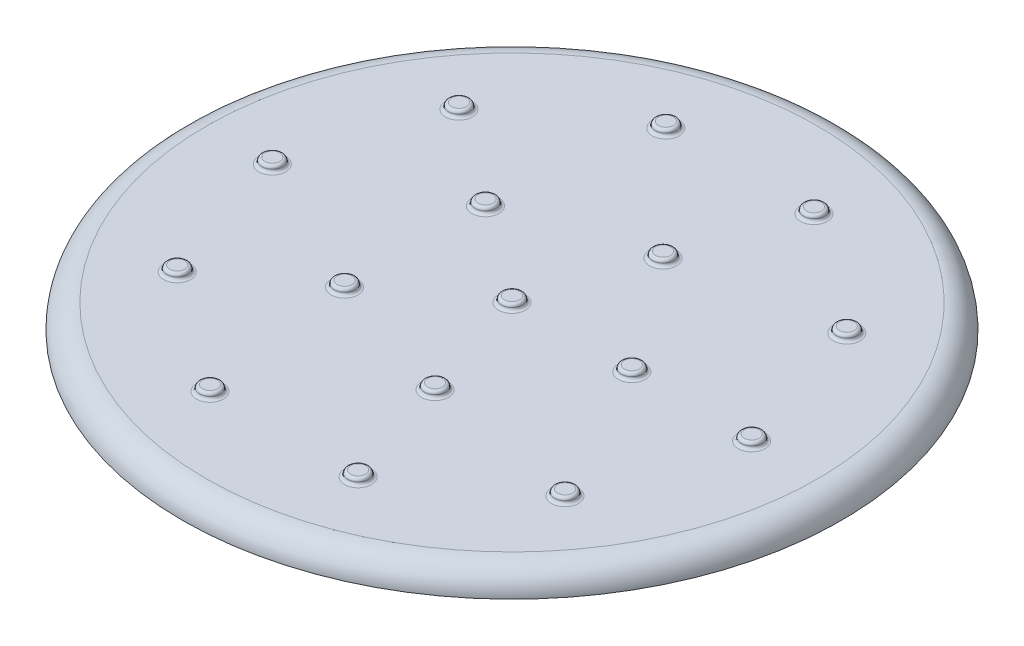
ISO-10303-21;
HEADER;
FILE_DESCRIPTION(('STEP AP214'),'2;1');
FILE_NAME('part.step','',(''),(''),'','','');
FILE_SCHEMA(('AUTOMOTIVE_DESIGN { 1 0 10303 214 1 1 1 1 }'));
ENDSEC;
DATA;
#1=APPLICATION_CONTEXT('core data for automotive mechanical design processes');
#2=APPLICATION_PROTOCOL_DEFINITION('international standard','automotive_design',2000,#1);
#3=PRODUCT_CONTEXT('',#1,'mechanical');
#4=PRODUCT('Part','Part','',(#3));
#5=PRODUCT_RELATED_PRODUCT_CATEGORY('part','',(#4));
#6=PRODUCT_DEFINITION_FORMATION('','',#4);
#7=PRODUCT_DEFINITION_CONTEXT('part definition',#1,'design');
#8=PRODUCT_DEFINITION('design','',#6,#7);
#9=PRODUCT_DEFINITION_SHAPE('','',#8);
#10=(LENGTH_UNIT() NAMED_UNIT(*) SI_UNIT(.MILLI.,.METRE.));
#11=(NAMED_UNIT(*) PLANE_ANGLE_UNIT() SI_UNIT($,.RADIAN.));
#12=(NAMED_UNIT(*) SI_UNIT($,.STERADIAN.) SOLID_ANGLE_UNIT());
#13=UNCERTAINTY_MEASURE_WITH_UNIT(LENGTH_MEASURE(1.E-05),#10,'distance_accuracy_value','');
#14=(GEOMETRIC_REPRESENTATION_CONTEXT(3) GLOBAL_UNCERTAINTY_ASSIGNED_CONTEXT((#13)) GLOBAL_UNIT_ASSIGNED_CONTEXT((#10,
#11,#12)) REPRESENTATION_CONTEXT('',''));
#15=CARTESIAN_POINT('',(0.,0.,0.));
#16=DIRECTION('',(0.,0.,1.));
#17=DIRECTION('',(1.,0.,0.));
#18=AXIS2_PLACEMENT_3D('',#15,#16,#17);
#19=CARTESIAN_POINT('',(0.,4.,0.));
#20=DIRECTION('',(0.,1.,0.));
#21=DIRECTION('',(0.,0.,1.));
#22=AXIS2_PLACEMENT_3D('',#19,#20,#21);
#23=PLANE('',#22);
#24=CARTESIAN_POINT('',(0.,4.,0.));
#25=DIRECTION('',(0.,1.,0.));
#26=DIRECTION('',(0.,0.,1.));
#27=AXIS2_PLACEMENT_3D('',#24,#25,#26);
#28=CIRCLE('',#27,2.25);
#29=CARTESIAN_POINT('',(0.,4.,2.25));
#30=VERTEX_POINT('',#29);
#31=EDGE_CURVE('E321',#30,#30,#28,.F.);
#32=ORIENTED_EDGE('',*,*,#31,.T.);
#33=EDGE_LOOP('',(#32));
#34=FACE_BOUND('',#33,.T.);
#35=CARTESIAN_POINT('',(20.,4.,0.));
#36=DIRECTION('',(0.,1.,0.));
#37=DIRECTION('',(0.,0.,1.));
#38=AXIS2_PLACEMENT_3D('',#35,#36,#37);
#39=CIRCLE('',#38,2.25);
#40=CARTESIAN_POINT('',(20.,4.,2.25));
#41=VERTEX_POINT('',#40);
#42=EDGE_CURVE('E399',#41,#41,#39,.F.);
#43=ORIENTED_EDGE('',*,*,#42,.T.);
#44=EDGE_LOOP('',(#43));
#45=FACE_BOUND('',#44,.T.);
#46=CARTESIAN_POINT('',(40.,4.,0.));
#47=DIRECTION('',(0.,1.,0.));
#48=DIRECTION('',(0.,0.,1.));
#49=AXIS2_PLACEMENT_3D('',#46,#47,#48);
#50=CIRCLE('',#49,2.25);
#51=CARTESIAN_POINT('',(40.,4.,2.25));
#52=VERTEX_POINT('',#51);
#53=EDGE_CURVE('E402',#52,#52,#50,.F.);
#54=ORIENTED_EDGE('',*,*,#53,.T.);
#55=EDGE_LOOP('',(#54));
#56=FACE_BOUND('',#55,.T.);
#57=CARTESIAN_POINT('',(6.1803398874989,4.,19.0211303259031));
#58=DIRECTION('',(0.,1.,0.));
#59=DIRECTION('',(0.,0.,1.));
#60=AXIS2_PLACEMENT_3D('',#57,#58,#59);
#61=CIRCLE('',#60,2.25);
#62=CARTESIAN_POINT('',(6.1803398874989,4.,21.2711303259031));
#63=VERTEX_POINT('',#62);
#64=EDGE_CURVE('E405',#63,#63,#61,.F.);
#65=ORIENTED_EDGE('',*,*,#64,.T.);
#66=EDGE_LOOP('',(#65));
#67=FACE_BOUND('',#66,.T.);
#68=CARTESIAN_POINT('',(-16.180339887499,4.,11.7557050458494));
#69=DIRECTION('',(0.,1.,0.));
#70=DIRECTION('',(0.,0.,1.));
#71=AXIS2_PLACEMENT_3D('',#68,#69,#70);
#72=CIRCLE('',#71,2.25);
#73=CARTESIAN_POINT('',(-16.180339887499,4.,14.0057050458494));
#74=VERTEX_POINT('',#73);
#75=EDGE_CURVE('E408',#74,#74,#72,.F.);
#76=ORIENTED_EDGE('',*,*,#75,.T.);
#77=EDGE_LOOP('',(#76));
#78=FACE_BOUND('',#77,.T.);
#79=CARTESIAN_POINT('',(-16.1803398874988,4.,-11.7557050458496));
#80=DIRECTION('',(0.,1.,0.));
#81=DIRECTION('',(0.,0.,1.));
#82=AXIS2_PLACEMENT_3D('',#79,#80,#81);
#83=CIRCLE('',#82,2.25);
#84=CARTESIAN_POINT('',(-16.1803398874988,4.,-9.5057050458496));
#85=VERTEX_POINT('',#84);
#86=EDGE_CURVE('E411',#85,#85,#83,.F.);
#87=ORIENTED_EDGE('',*,*,#86,.T.);
#88=EDGE_LOOP('',(#87));
#89=FACE_BOUND('',#88,.T.);
#90=CARTESIAN_POINT('',(6.18033988749916,4.,-19.021130325903));
#91=DIRECTION('',(0.,1.,0.));
#92=DIRECTION('',(0.,0.,1.));
#93=AXIS2_PLACEMENT_3D('',#90,#91,#92);
#94=CIRCLE('',#93,2.25);
#95=CARTESIAN_POINT('',(6.18033988749916,4.,-16.771130325903));
#96=VERTEX_POINT('',#95);
#97=EDGE_CURVE('E414',#96,#96,#94,.F.);
#98=ORIENTED_EDGE('',*,*,#97,.T.);
#99=EDGE_LOOP('',(#98));
#100=FACE_BOUND('',#99,.T.);
#101=CARTESIAN_POINT('',(32.3606797749979,4.,23.511410091699));
#102=DIRECTION('',(0.,1.,0.));
#103=DIRECTION('',(0.,0.,1.));
#104=AXIS2_PLACEMENT_3D('',#101,#102,#103);
#105=CIRCLE('',#104,2.25);
#106=CARTESIAN_POINT('',(32.3606797749979,4.,25.761410091699));
#107=VERTEX_POINT('',#106);
#108=EDGE_CURVE('E417',#107,#107,#105,.F.);
#109=ORIENTED_EDGE('',*,*,#108,.T.);
#110=EDGE_LOOP('',(#109));
#111=FACE_BOUND('',#110,.T.);
#112=CARTESIAN_POINT('',(12.3606797749978,4.,38.0422606518062));
#113=DIRECTION('',(0.,1.,0.));
#114=DIRECTION('',(0.,0.,1.));
#115=AXIS2_PLACEMENT_3D('',#112,#113,#114);
#116=CIRCLE('',#115,2.25);
#117=CARTESIAN_POINT('',(12.3606797749978,4.,40.2922606518062));
#118=VERTEX_POINT('',#117);
#119=EDGE_CURVE('E420',#118,#118,#116,.F.);
#120=ORIENTED_EDGE('',*,*,#119,.T.);
#121=EDGE_LOOP('',(#120));
#122=FACE_BOUND('',#121,.T.);
#123=CARTESIAN_POINT('',(-12.3606797749981,4.,38.0422606518061));
#124=DIRECTION('',(0.,1.,0.));
#125=DIRECTION('',(0.,0.,1.));
#126=AXIS2_PLACEMENT_3D('',#123,#124,#125);
#127=CIRCLE('',#126,2.25);
#128=CARTESIAN_POINT('',(-12.3606797749981,4.,40.2922606518061));
#129=VERTEX_POINT('',#128);
#130=EDGE_CURVE('E423',#129,#129,#127,.F.);
#131=ORIENTED_EDGE('',*,*,#130,.T.);
#132=EDGE_LOOP('',(#131));
#133=FACE_BOUND('',#132,.T.);
#134=CARTESIAN_POINT('',(-32.360679774998,4.,23.5114100916987));
#135=DIRECTION('',(0.,1.,0.));
#136=DIRECTION('',(0.,0.,1.));
#137=AXIS2_PLACEMENT_3D('',#134,#135,#136);
#138=CIRCLE('',#137,2.25);
#139=CARTESIAN_POINT('',(-32.360679774998,4.,25.7614100916987));
#140=VERTEX_POINT('',#139);
#141=EDGE_CURVE('E426',#140,#140,#138,.F.);
#142=ORIENTED_EDGE('',*,*,#141,.T.);
#143=EDGE_LOOP('',(#142));
#144=FACE_BOUND('',#143,.T.);
#145=CARTESIAN_POINT('',(-40.,4.,-2.79318507107451E-13));
#146=DIRECTION('',(0.,1.,0.));
#147=DIRECTION('',(0.,0.,1.));
#148=AXIS2_PLACEMENT_3D('',#145,#146,#147);
#149=CIRCLE('',#148,2.25000000000001);
#150=CARTESIAN_POINT('',(-40.,4.,2.24999999999973));
#151=VERTEX_POINT('',#150);
#152=EDGE_CURVE('E429',#151,#151,#149,.F.);
#153=ORIENTED_EDGE('',*,*,#152,.T.);
#154=EDGE_LOOP('',(#153));
#155=FACE_BOUND('',#154,.T.);
#156=CARTESIAN_POINT('',(-32.3606797749977,4.,-23.5114100916992));
#157=DIRECTION('',(0.,1.,0.));
#158=DIRECTION('',(0.,0.,1.));
#159=AXIS2_PLACEMENT_3D('',#156,#157,#158);
#160=CIRCLE('',#159,2.25);
#161=CARTESIAN_POINT('',(-32.3606797749977,4.,-21.2614100916992));
#162=VERTEX_POINT('',#161);
#163=EDGE_CURVE('E432',#162,#162,#160,.F.);
#164=ORIENTED_EDGE('',*,*,#163,.T.);
#165=EDGE_LOOP('',(#164));
#166=FACE_BOUND('',#165,.T.);
#167=CARTESIAN_POINT('',(-12.3606797749975,4.,-38.0422606518063));
#168=DIRECTION('',(0.,1.,0.));
#169=DIRECTION('',(0.,0.,1.));
#170=AXIS2_PLACEMENT_3D('',#167,#168,#169);
#171=CIRCLE('',#170,2.25);
#172=CARTESIAN_POINT('',(-12.3606797749975,4.,-35.7922606518063));
#173=VERTEX_POINT('',#172);
#174=EDGE_CURVE('E435',#173,#173,#171,.F.);
#175=ORIENTED_EDGE('',*,*,#174,.T.);
#176=EDGE_LOOP('',(#175));
#177=FACE_BOUND('',#176,.T.);
#178=CARTESIAN_POINT('',(12.3606797749983,4.,-38.042260651806));
#179=DIRECTION('',(0.,1.,0.));
#180=DIRECTION('',(0.,0.,1.));
#181=AXIS2_PLACEMENT_3D('',#178,#179,#180);
#182=CIRCLE('',#181,2.25);
#183=CARTESIAN_POINT('',(12.3606797749983,4.,-35.792260651806));
#184=VERTEX_POINT('',#183);
#185=EDGE_CURVE('E438',#184,#184,#182,.F.);
#186=ORIENTED_EDGE('',*,*,#185,.T.);
#187=EDGE_LOOP('',(#186));
#188=FACE_BOUND('',#187,.T.);
#189=CARTESIAN_POINT('',(32.3606797749982,4.,-23.5114100916985));
#190=DIRECTION('',(0.,1.,0.));
#191=DIRECTION('',(0.,0.,1.));
#192=AXIS2_PLACEMENT_3D('',#189,#190,#191);
#193=CIRCLE('',#192,2.25);
#194=CARTESIAN_POINT('',(32.3606797749982,4.,-21.2614100916985));
#195=VERTEX_POINT('',#194);
#196=EDGE_CURVE('E441',#195,#195,#193,.F.);
#197=ORIENTED_EDGE('',*,*,#196,.T.);
#198=EDGE_LOOP('',(#197));
#199=FACE_BOUND('',#198,.T.);
#200=CARTESIAN_POINT('',(0.,4.,0.));
#201=DIRECTION('',(0.,1.,0.));
#202=DIRECTION('',(0.,0.,1.));
#203=AXIS2_PLACEMENT_3D('',#200,#201,#202);
#204=CIRCLE('',#203,51.);
#205=CARTESIAN_POINT('',(0.,4.,51.));
#206=VERTEX_POINT('',#205);
#207=EDGE_CURVE('E444',#206,#206,#204,.T.);
#208=ORIENTED_EDGE('',*,*,#207,.T.);
#209=EDGE_LOOP('',(#208));
#210=FACE_BOUND('',#209,.T.);
#211=ADVANCED_FACE('F31',(#34,#45,#56,#67,#78,#89,#100,#111,#122,#133,#144,#155,#166,#177,#188,
#199,#210),#23,.T.);
#212=CARTESIAN_POINT('',(0.,0.,0.));
#213=DIRECTION('',(0.,1.,0.));
#214=DIRECTION('',(0.,0.,1.));
#215=AXIS2_PLACEMENT_3D('',#212,#213,#214);
#216=PLANE('',#215);
#217=CARTESIAN_POINT('',(0.,0.,0.));
#218=DIRECTION('',(0.,1.,0.));
#219=DIRECTION('',(0.,0.,1.));
#220=AXIS2_PLACEMENT_3D('',#217,#218,#219);
#221=CIRCLE('',#220,55.);
#222=CARTESIAN_POINT('',(0.,0.,55.));
#223=VERTEX_POINT('',#222);
#224=EDGE_CURVE('E51',#223,#223,#221,.T.);
#225=ORIENTED_EDGE('',*,*,#224,.F.);
#226=EDGE_LOOP('',(#225));
#227=FACE_BOUND('',#226,.T.);
#228=ADVANCED_FACE('F111',(#227),#216,.F.);
#229=CARTESIAN_POINT('',(0.,0.,0.));
#230=DIRECTION('',(0.,1.,0.));
#231=DIRECTION('',(0.,0.,1.));
#232=AXIS2_PLACEMENT_3D('',#229,#230,#231);
#233=TOROIDAL_SURFACE('',#232,51.,4.);
#234=ORIENTED_EDGE('',*,*,#224,.T.);
#235=EDGE_LOOP('',(#234));
#236=FACE_BOUND('',#235,.T.);
#237=ORIENTED_EDGE('',*,*,#207,.F.);
#238=EDGE_LOOP('',(#237));
#239=FACE_BOUND('',#238,.T.);
#240=ADVANCED_FACE('F117',(#236,#239),#233,.T.);
#241=CARTESIAN_POINT('',(0.,5.,0.));
#242=DIRECTION('',(0.,1.,0.));
#243=DIRECTION('',(0.,0.,1.));
#244=AXIS2_PLACEMENT_3D('',#241,#242,#243);
#245=PLANE('',#244);
#246=CARTESIAN_POINT('',(0.,5.,0.));
#247=DIRECTION('',(0.,1.,0.));
#248=DIRECTION('',(0.,0.,1.));
#249=AXIS2_PLACEMENT_3D('',#246,#247,#248);
#250=CIRCLE('',#249,1.25);
#251=CARTESIAN_POINT('',(0.,5.,1.25));
#252=VERTEX_POINT('',#251);
#253=EDGE_CURVE('E315',#252,#252,#250,.T.);
#254=ORIENTED_EDGE('',*,*,#253,.T.);
#255=EDGE_LOOP('',(#254));
#256=FACE_BOUND('',#255,.T.);
#257=ADVANCED_FACE('F123',(#256),#245,.T.);
#258=CARTESIAN_POINT('',(20.,5.,0.));
#259=DIRECTION('',(0.,1.,0.));
#260=DIRECTION('',(0.,0.,1.));
#261=AXIS2_PLACEMENT_3D('',#258,#259,#260);
#262=PLANE('',#261);
#263=CARTESIAN_POINT('',(20.,5.,0.));
#264=DIRECTION('',(0.,1.,0.));
#265=DIRECTION('',(0.,0.,1.));
#266=AXIS2_PLACEMENT_3D('',#263,#264,#265);
#267=CIRCLE('',#266,1.25);
#268=CARTESIAN_POINT('',(20.,5.,1.25));
#269=VERTEX_POINT('',#268);
#270=EDGE_CURVE('E313',#269,#269,#267,.T.);
#271=ORIENTED_EDGE('',*,*,#270,.T.);
#272=EDGE_LOOP('',(#271));
#273=FACE_BOUND('',#272,.T.);
#274=ADVANCED_FACE('F303',(#273),#262,.T.);
#275=CARTESIAN_POINT('',(40.,5.,0.));
#276=DIRECTION('',(0.,1.,0.));
#277=DIRECTION('',(0.,0.,1.));
#278=AXIS2_PLACEMENT_3D('',#275,#276,#277);
#279=PLANE('',#278);
#280=CARTESIAN_POINT('',(40.,5.,0.));
#281=DIRECTION('',(0.,1.,0.));
#282=DIRECTION('',(0.,0.,1.));
#283=AXIS2_PLACEMENT_3D('',#280,#281,#282);
#284=CIRCLE('',#283,1.25);
#285=CARTESIAN_POINT('',(40.,5.,1.25));
#286=VERTEX_POINT('',#285);
#287=EDGE_CURVE('E314',#286,#286,#284,.T.);
#288=ORIENTED_EDGE('',*,*,#287,.T.);
#289=EDGE_LOOP('',(#288));
#290=FACE_BOUND('',#289,.T.);
#291=ADVANCED_FACE('F300',(#290),#279,.T.);
#292=CARTESIAN_POINT('',(6.1803398874989,5.,19.0211303259031));
#293=DIRECTION('',(0.,1.,0.));
#294=DIRECTION('',(0.,0.,1.));
#295=AXIS2_PLACEMENT_3D('',#292,#293,#294);
#296=PLANE('',#295);
#297=CARTESIAN_POINT('',(6.1803398874989,5.,19.0211303259031));
#298=DIRECTION('',(0.,1.,0.));
#299=DIRECTION('',(0.,0.,1.));
#300=AXIS2_PLACEMENT_3D('',#297,#298,#299);
#301=CIRCLE('',#300,1.25);
#302=CARTESIAN_POINT('',(6.1803398874989,5.,20.2711303259031));
#303=VERTEX_POINT('',#302);
#304=EDGE_CURVE('E318',#303,#303,#301,.T.);
#305=ORIENTED_EDGE('',*,*,#304,.T.);
#306=EDGE_LOOP('',(#305));
#307=FACE_BOUND('',#306,.T.);
#308=ADVANCED_FACE('F296',(#307),#296,.T.);
#309=CARTESIAN_POINT('',(-16.180339887499,5.,11.7557050458494));
#310=DIRECTION('',(0.,1.,0.));
#311=DIRECTION('',(0.,0.,1.));
#312=AXIS2_PLACEMENT_3D('',#309,#310,#311);
#313=PLANE('',#312);
#314=CARTESIAN_POINT('',(-16.180339887499,5.,11.7557050458494));
#315=DIRECTION('',(0.,1.,0.));
#316=DIRECTION('',(0.,0.,1.));
#317=AXIS2_PLACEMENT_3D('',#314,#315,#316);
#318=CIRCLE('',#317,1.25);
#319=CARTESIAN_POINT('',(-16.180339887499,5.,13.0057050458494));
#320=VERTEX_POINT('',#319);
#321=EDGE_CURVE('E327',#320,#320,#318,.T.);
#322=ORIENTED_EDGE('',*,*,#321,.T.);
#323=EDGE_LOOP('',(#322));
#324=FACE_BOUND('',#323,.T.);
#325=ADVANCED_FACE('F292',(#324),#313,.T.);
#326=CARTESIAN_POINT('',(-16.1803398874988,5.,-11.7557050458496));
#327=DIRECTION('',(0.,1.,0.));
#328=DIRECTION('',(0.,0.,1.));
#329=AXIS2_PLACEMENT_3D('',#326,#327,#328);
#330=PLANE('',#329);
#331=CARTESIAN_POINT('',(-16.1803398874988,5.,-11.7557050458496));
#332=DIRECTION('',(0.,1.,0.));
#333=DIRECTION('',(0.,0.,1.));
#334=AXIS2_PLACEMENT_3D('',#331,#332,#333);
#335=CIRCLE('',#334,1.25);
#336=CARTESIAN_POINT('',(-16.1803398874988,5.,-10.5057050458496));
#337=VERTEX_POINT('',#336);
#338=EDGE_CURVE('E330',#337,#337,#335,.T.);
#339=ORIENTED_EDGE('',*,*,#338,.T.);
#340=EDGE_LOOP('',(#339));
#341=FACE_BOUND('',#340,.T.);
#342=ADVANCED_FACE('F288',(#341),#330,.T.);
#343=CARTESIAN_POINT('',(6.18033988749916,5.,-19.021130325903));
#344=DIRECTION('',(0.,1.,0.));
#345=DIRECTION('',(0.,0.,1.));
#346=AXIS2_PLACEMENT_3D('',#343,#344,#345);
#347=PLANE('',#346);
#348=CARTESIAN_POINT('',(6.18033988749916,5.,-19.021130325903));
#349=DIRECTION('',(0.,1.,0.));
#350=DIRECTION('',(0.,0.,1.));
#351=AXIS2_PLACEMENT_3D('',#348,#349,#350);
#352=CIRCLE('',#351,1.25);
#353=CARTESIAN_POINT('',(6.18033988749916,5.,-17.771130325903));
#354=VERTEX_POINT('',#353);
#355=EDGE_CURVE('E333',#354,#354,#352,.T.);
#356=ORIENTED_EDGE('',*,*,#355,.T.);
#357=EDGE_LOOP('',(#356));
#358=FACE_BOUND('',#357,.T.);
#359=ADVANCED_FACE('F284',(#358),#347,.T.);
#360=CARTESIAN_POINT('',(32.3606797749979,5.,23.511410091699));
#361=DIRECTION('',(0.,1.,0.));
#362=DIRECTION('',(0.,0.,1.));
#363=AXIS2_PLACEMENT_3D('',#360,#361,#362);
#364=PLANE('',#363);
#365=CARTESIAN_POINT('',(32.3606797749979,5.,23.511410091699));
#366=DIRECTION('',(0.,1.,0.));
#367=DIRECTION('',(0.,0.,1.));
#368=AXIS2_PLACEMENT_3D('',#365,#366,#367);
#369=CIRCLE('',#368,1.25);
#370=CARTESIAN_POINT('',(32.3606797749979,5.,24.761410091699));
#371=VERTEX_POINT('',#370);
#372=EDGE_CURVE('E336',#371,#371,#369,.T.);
#373=ORIENTED_EDGE('',*,*,#372,.T.);
#374=EDGE_LOOP('',(#373));
#375=FACE_BOUND('',#374,.T.);
#376=ADVANCED_FACE('F280',(#375),#364,.T.);
#377=CARTESIAN_POINT('',(12.3606797749978,5.,38.0422606518062));
#378=DIRECTION('',(0.,1.,0.));
#379=DIRECTION('',(0.,0.,1.));
#380=AXIS2_PLACEMENT_3D('',#377,#378,#379);
#381=PLANE('',#380);
#382=CARTESIAN_POINT('',(12.3606797749978,5.,38.0422606518062));
#383=DIRECTION('',(0.,1.,0.));
#384=DIRECTION('',(0.,0.,1.));
#385=AXIS2_PLACEMENT_3D('',#382,#383,#384);
#386=CIRCLE('',#385,1.25);
#387=CARTESIAN_POINT('',(12.3606797749978,5.,39.2922606518062));
#388=VERTEX_POINT('',#387);
#389=EDGE_CURVE('E339',#388,#388,#386,.T.);
#390=ORIENTED_EDGE('',*,*,#389,.T.);
#391=EDGE_LOOP('',(#390));
#392=FACE_BOUND('',#391,.T.);
#393=ADVANCED_FACE('F276',(#392),#381,.T.);
#394=CARTESIAN_POINT('',(-12.3606797749981,5.,38.0422606518061));
#395=DIRECTION('',(0.,1.,0.));
#396=DIRECTION('',(0.,0.,1.));
#397=AXIS2_PLACEMENT_3D('',#394,#395,#396);
#398=PLANE('',#397);
#399=CARTESIAN_POINT('',(-12.3606797749981,5.,38.0422606518061));
#400=DIRECTION('',(0.,1.,0.));
#401=DIRECTION('',(0.,0.,1.));
#402=AXIS2_PLACEMENT_3D('',#399,#400,#401);
#403=CIRCLE('',#402,1.25);
#404=CARTESIAN_POINT('',(-12.3606797749981,5.,39.2922606518061));
#405=VERTEX_POINT('',#404);
#406=EDGE_CURVE('E342',#405,#405,#403,.T.);
#407=ORIENTED_EDGE('',*,*,#406,.T.);
#408=EDGE_LOOP('',(#407));
#409=FACE_BOUND('',#408,.T.);
#410=ADVANCED_FACE('F272',(#409),#398,.T.);
#411=CARTESIAN_POINT('',(-32.360679774998,5.,23.5114100916987));
#412=DIRECTION('',(0.,1.,0.));
#413=DIRECTION('',(0.,0.,1.));
#414=AXIS2_PLACEMENT_3D('',#411,#412,#413);
#415=PLANE('',#414);
#416=CARTESIAN_POINT('',(-32.360679774998,5.,23.5114100916987));
#417=DIRECTION('',(0.,1.,0.));
#418=DIRECTION('',(0.,0.,1.));
#419=AXIS2_PLACEMENT_3D('',#416,#417,#418);
#420=CIRCLE('',#419,1.25);
#421=CARTESIAN_POINT('',(-32.360679774998,5.,24.7614100916987));
#422=VERTEX_POINT('',#421);
#423=EDGE_CURVE('E345',#422,#422,#420,.T.);
#424=ORIENTED_EDGE('',*,*,#423,.T.);
#425=EDGE_LOOP('',(#424));
#426=FACE_BOUND('',#425,.T.);
#427=ADVANCED_FACE('F268',(#426),#415,.T.);
#428=CARTESIAN_POINT('',(-40.,5.,-2.79318507107451E-13));
#429=DIRECTION('',(0.,1.,0.));
#430=DIRECTION('',(0.,0.,1.));
#431=AXIS2_PLACEMENT_3D('',#428,#429,#430);
#432=PLANE('',#431);
#433=CARTESIAN_POINT('',(-40.,5.,-2.79318507107451E-13));
#434=DIRECTION('',(0.,1.,0.));
#435=DIRECTION('',(0.,0.,1.));
#436=AXIS2_PLACEMENT_3D('',#433,#434,#435);
#437=CIRCLE('',#436,1.25000000000001);
#438=CARTESIAN_POINT('',(-40.,5.,1.24999999999973));
#439=VERTEX_POINT('',#438);
#440=EDGE_CURVE('E348',#439,#439,#437,.T.);
#441=ORIENTED_EDGE('',*,*,#440,.T.);
#442=EDGE_LOOP('',(#441));
#443=FACE_BOUND('',#442,.T.);
#444=ADVANCED_FACE('F264',(#443),#432,.T.);
#445=CARTESIAN_POINT('',(-32.3606797749977,5.,-23.5114100916992));
#446=DIRECTION('',(0.,1.,0.));
#447=DIRECTION('',(0.,0.,1.));
#448=AXIS2_PLACEMENT_3D('',#445,#446,#447);
#449=PLANE('',#448);
#450=CARTESIAN_POINT('',(-32.3606797749977,5.,-23.5114100916992));
#451=DIRECTION('',(0.,1.,0.));
#452=DIRECTION('',(0.,0.,1.));
#453=AXIS2_PLACEMENT_3D('',#450,#451,#452);
#454=CIRCLE('',#453,1.25);
#455=CARTESIAN_POINT('',(-32.3606797749977,5.,-22.2614100916992));
#456=VERTEX_POINT('',#455);
#457=EDGE_CURVE('E351',#456,#456,#454,.T.);
#458=ORIENTED_EDGE('',*,*,#457,.T.);
#459=EDGE_LOOP('',(#458));
#460=FACE_BOUND('',#459,.T.);
#461=ADVANCED_FACE('F258',(#460),#449,.T.);
#462=CARTESIAN_POINT('',(-12.3606797749975,5.,-38.0422606518063));
#463=DIRECTION('',(0.,1.,0.));
#464=DIRECTION('',(0.,0.,1.));
#465=AXIS2_PLACEMENT_3D('',#462,#463,#464);
#466=PLANE('',#465);
#467=CARTESIAN_POINT('',(-12.3606797749975,5.,-38.0422606518063));
#468=DIRECTION('',(0.,1.,0.));
#469=DIRECTION('',(0.,0.,1.));
#470=AXIS2_PLACEMENT_3D('',#467,#468,#469);
#471=CIRCLE('',#470,1.25);
#472=CARTESIAN_POINT('',(-12.3606797749975,5.,-36.7922606518063));
#473=VERTEX_POINT('',#472);
#474=EDGE_CURVE('E44',#473,#473,#471,.T.);
#475=ORIENTED_EDGE('',*,*,#474,.T.);
#476=EDGE_LOOP('',(#475));
#477=FACE_BOUND('',#476,.T.);
#478=ADVANCED_FACE('F251',(#477),#466,.T.);
#479=CARTESIAN_POINT('',(12.3606797749983,5.,-38.042260651806));
#480=DIRECTION('',(0.,1.,0.));
#481=DIRECTION('',(0.,0.,1.));
#482=AXIS2_PLACEMENT_3D('',#479,#480,#481);
#483=PLANE('',#482);
#484=CARTESIAN_POINT('',(12.3606797749983,5.,-38.042260651806));
#485=DIRECTION('',(0.,1.,0.));
#486=DIRECTION('',(0.,0.,1.));
#487=AXIS2_PLACEMENT_3D('',#484,#485,#486);
#488=CIRCLE('',#487,1.25);
#489=CARTESIAN_POINT('',(12.3606797749983,5.,-36.792260651806));
#490=VERTEX_POINT('',#489);
#491=EDGE_CURVE('E39',#490,#490,#488,.T.);
#492=ORIENTED_EDGE('',*,*,#491,.T.);
#493=EDGE_LOOP('',(#492));
#494=FACE_BOUND('',#493,.T.);
#495=ADVANCED_FACE('F249',(#494),#483,.T.);
#496=CARTESIAN_POINT('',(32.3606797749982,5.,-23.5114100916985));
#497=DIRECTION('',(0.,1.,0.));
#498=DIRECTION('',(0.,0.,1.));
#499=AXIS2_PLACEMENT_3D('',#496,#497,#498);
#500=PLANE('',#499);
#501=CARTESIAN_POINT('',(32.3606797749982,5.,-23.5114100916985));
#502=DIRECTION('',(0.,1.,0.));
#503=DIRECTION('',(0.,0.,1.));
#504=AXIS2_PLACEMENT_3D('',#501,#502,#503);
#505=CIRCLE('',#504,1.25);
#506=CARTESIAN_POINT('',(32.3606797749982,5.,-22.2614100916985));
#507=VERTEX_POINT('',#506);
#508=EDGE_CURVE('E10',#507,#507,#505,.T.);
#509=ORIENTED_EDGE('',*,*,#508,.T.);
#510=EDGE_LOOP('',(#509));
#511=FACE_BOUND('',#510,.T.);
#512=ADVANCED_FACE('F137',(#511),#500,.T.);
#513=CARTESIAN_POINT('',(0.,4.5,0.));
#514=DIRECTION('',(0.,1.,0.));
#515=DIRECTION('',(0.,0.,1.));
#516=AXIS2_PLACEMENT_3D('',#513,#514,#515);
#517=TOROIDAL_SURFACE('',#516,1.25,0.5);
#518=ORIENTED_EDGE('',*,*,#253,.F.);
#519=EDGE_LOOP('',(#518));
#520=FACE_BOUND('',#519,.T.);
#521=CARTESIAN_POINT('',(0.,4.5,0.));
#522=DIRECTION('',(0.,1.,0.));
#523=DIRECTION('',(0.,0.,1.));
#524=AXIS2_PLACEMENT_3D('',#521,#522,#523);
#525=CIRCLE('',#524,1.75);
#526=CARTESIAN_POINT('',(0.,4.5,1.75));
#527=VERTEX_POINT('',#526);
#528=EDGE_CURVE('E48',#527,#527,#525,.F.);
#529=ORIENTED_EDGE('',*,*,#528,.F.);
#530=EDGE_LOOP('',(#529));
#531=FACE_BOUND('',#530,.T.);
#532=ADVANCED_FACE('F133',(#520,#531),#517,.T.);
#533=CARTESIAN_POINT('',(0.,4.5,0.));
#534=DIRECTION('',(0.,1.,0.));
#535=DIRECTION('',(0.,0.,1.));
#536=AXIS2_PLACEMENT_3D('',#533,#534,#535);
#537=TOROIDAL_SURFACE('',#536,2.25,0.5);
#538=ORIENTED_EDGE('',*,*,#31,.F.);
#539=EDGE_LOOP('',(#538));
#540=FACE_BOUND('',#539,.T.);
#541=ORIENTED_EDGE('',*,*,#528,.T.);
#542=EDGE_LOOP('',(#541));
#543=FACE_BOUND('',#542,.T.);
#544=ADVANCED_FACE('F129',(#540,#543),#537,.F.);
#545=CARTESIAN_POINT('',(20.,4.5,0.));
#546=DIRECTION('',(0.,1.,0.));
#547=DIRECTION('',(0.,0.,1.));
#548=AXIS2_PLACEMENT_3D('',#545,#546,#547);
#549=TOROIDAL_SURFACE('',#548,1.25,0.5);
#550=ORIENTED_EDGE('',*,*,#270,.F.);
#551=EDGE_LOOP('',(#550));
#552=FACE_BOUND('',#551,.T.);
#553=CARTESIAN_POINT('',(20.,4.5,0.));
#554=DIRECTION('',(0.,1.,0.));
#555=DIRECTION('',(0.,0.,1.));
#556=AXIS2_PLACEMENT_3D('',#553,#554,#555);
#557=CIRCLE('',#556,1.75);
#558=CARTESIAN_POINT('',(20.,4.5,1.75));
#559=VERTEX_POINT('',#558);
#560=EDGE_CURVE('E52',#559,#559,#557,.F.);
#561=ORIENTED_EDGE('',*,*,#560,.F.);
#562=EDGE_LOOP('',(#561));
#563=FACE_BOUND('',#562,.T.);
#564=ADVANCED_FACE('F132',(#552,#563),#549,.T.);
#565=CARTESIAN_POINT('',(20.,4.5,0.));
#566=DIRECTION('',(0.,1.,0.));
#567=DIRECTION('',(0.,0.,1.));
#568=AXIS2_PLACEMENT_3D('',#565,#566,#567);
#569=TOROIDAL_SURFACE('',#568,2.25,0.5);
#570=ORIENTED_EDGE('',*,*,#42,.F.);
#571=EDGE_LOOP('',(#570));
#572=FACE_BOUND('',#571,.T.);
#573=ORIENTED_EDGE('',*,*,#560,.T.);
#574=EDGE_LOOP('',(#573));
#575=FACE_BOUND('',#574,.T.);
#576=ADVANCED_FACE('F139',(#572,#575),#569,.F.);
#577=CARTESIAN_POINT('',(40.,4.5,0.));
#578=DIRECTION('',(0.,1.,0.));
#579=DIRECTION('',(0.,0.,1.));
#580=AXIS2_PLACEMENT_3D('',#577,#578,#579);
#581=TOROIDAL_SURFACE('',#580,1.25,0.5);
#582=ORIENTED_EDGE('',*,*,#287,.F.);
#583=EDGE_LOOP('',(#582));
#584=FACE_BOUND('',#583,.T.);
#585=CARTESIAN_POINT('',(40.,4.5,0.));
#586=DIRECTION('',(0.,1.,0.));
#587=DIRECTION('',(0.,0.,1.));
#588=AXIS2_PLACEMENT_3D('',#585,#586,#587);
#589=CIRCLE('',#588,1.75);
#590=CARTESIAN_POINT('',(40.,4.5,1.75));
#591=VERTEX_POINT('',#590);
#592=EDGE_CURVE('E55',#591,#591,#589,.F.);
#593=ORIENTED_EDGE('',*,*,#592,.F.);
#594=EDGE_LOOP('',(#593));
#595=FACE_BOUND('',#594,.T.);
#596=ADVANCED_FACE('F142',(#584,#595),#581,.T.);
#597=CARTESIAN_POINT('',(40.,4.5,0.));
#598=DIRECTION('',(0.,1.,0.));
#599=DIRECTION('',(0.,0.,1.));
#600=AXIS2_PLACEMENT_3D('',#597,#598,#599);
#601=TOROIDAL_SURFACE('',#600,2.25,0.5);
#602=ORIENTED_EDGE('',*,*,#53,.F.);
#603=EDGE_LOOP('',(#602));
#604=FACE_BOUND('',#603,.T.);
#605=ORIENTED_EDGE('',*,*,#592,.T.);
#606=EDGE_LOOP('',(#605));
#607=FACE_BOUND('',#606,.T.);
#608=ADVANCED_FACE('F147',(#604,#607),#601,.F.);
#609=CARTESIAN_POINT('',(6.1803398874989,4.5,19.0211303259031));
#610=DIRECTION('',(0.,1.,0.));
#611=DIRECTION('',(0.,0.,1.));
#612=AXIS2_PLACEMENT_3D('',#609,#610,#611);
#613=TOROIDAL_SURFACE('',#612,1.25,0.5);
#614=ORIENTED_EDGE('',*,*,#304,.F.);
#615=EDGE_LOOP('',(#614));
#616=FACE_BOUND('',#615,.T.);
#617=CARTESIAN_POINT('',(6.1803398874989,4.5,19.0211303259031));
#618=DIRECTION('',(0.,1.,0.));
#619=DIRECTION('',(0.,0.,1.));
#620=AXIS2_PLACEMENT_3D('',#617,#618,#619);
#621=CIRCLE('',#620,1.75);
#622=CARTESIAN_POINT('',(6.1803398874989,4.5,20.7711303259031));
#623=VERTEX_POINT('',#622);
#624=EDGE_CURVE('E58',#623,#623,#621,.F.);
#625=ORIENTED_EDGE('',*,*,#624,.F.);
#626=EDGE_LOOP('',(#625));
#627=FACE_BOUND('',#626,.T.);
#628=ADVANCED_FACE('F150',(#616,#627),#613,.T.);
#629=CARTESIAN_POINT('',(6.1803398874989,4.5,19.0211303259031));
#630=DIRECTION('',(0.,1.,0.));
#631=DIRECTION('',(0.,0.,1.));
#632=AXIS2_PLACEMENT_3D('',#629,#630,#631);
#633=TOROIDAL_SURFACE('',#632,2.25,0.5);
#634=ORIENTED_EDGE('',*,*,#64,.F.);
#635=EDGE_LOOP('',(#634));
#636=FACE_BOUND('',#635,.T.);
#637=ORIENTED_EDGE('',*,*,#624,.T.);
#638=EDGE_LOOP('',(#637));
#639=FACE_BOUND('',#638,.T.);
#640=ADVANCED_FACE('F155',(#636,#639),#633,.F.);
#641=CARTESIAN_POINT('',(-16.180339887499,4.5,11.7557050458494));
#642=DIRECTION('',(0.,1.,0.));
#643=DIRECTION('',(0.,0.,1.));
#644=AXIS2_PLACEMENT_3D('',#641,#642,#643);
#645=TOROIDAL_SURFACE('',#644,1.25,0.5);
#646=ORIENTED_EDGE('',*,*,#321,.F.);
#647=EDGE_LOOP('',(#646));
#648=FACE_BOUND('',#647,.T.);
#649=CARTESIAN_POINT('',(-16.180339887499,4.5,11.7557050458494));
#650=DIRECTION('',(0.,1.,0.));
#651=DIRECTION('',(0.,0.,1.));
#652=AXIS2_PLACEMENT_3D('',#649,#650,#651);
#653=CIRCLE('',#652,1.75);
#654=CARTESIAN_POINT('',(-16.180339887499,4.5,13.5057050458494));
#655=VERTEX_POINT('',#654);
#656=EDGE_CURVE('E61',#655,#655,#653,.F.);
#657=ORIENTED_EDGE('',*,*,#656,.F.);
#658=EDGE_LOOP('',(#657));
#659=FACE_BOUND('',#658,.T.);
#660=ADVANCED_FACE('F158',(#648,#659),#645,.T.);
#661=CARTESIAN_POINT('',(-16.180339887499,4.5,11.7557050458494));
#662=DIRECTION('',(0.,1.,0.));
#663=DIRECTION('',(0.,0.,1.));
#664=AXIS2_PLACEMENT_3D('',#661,#662,#663);
#665=TOROIDAL_SURFACE('',#664,2.25,0.5);
#666=ORIENTED_EDGE('',*,*,#75,.F.);
#667=EDGE_LOOP('',(#666));
#668=FACE_BOUND('',#667,.T.);
#669=ORIENTED_EDGE('',*,*,#656,.T.);
#670=EDGE_LOOP('',(#669));
#671=FACE_BOUND('',#670,.T.);
#672=ADVANCED_FACE('F163',(#668,#671),#665,.F.);
#673=CARTESIAN_POINT('',(-16.1803398874988,4.5,-11.7557050458496));
#674=DIRECTION('',(0.,1.,0.));
#675=DIRECTION('',(0.,0.,1.));
#676=AXIS2_PLACEMENT_3D('',#673,#674,#675);
#677=TOROIDAL_SURFACE('',#676,1.25,0.5);
#678=ORIENTED_EDGE('',*,*,#338,.F.);
#679=EDGE_LOOP('',(#678));
#680=FACE_BOUND('',#679,.T.);
#681=CARTESIAN_POINT('',(-16.1803398874988,4.5,-11.7557050458496));
#682=DIRECTION('',(0.,1.,0.));
#683=DIRECTION('',(0.,0.,1.));
#684=AXIS2_PLACEMENT_3D('',#681,#682,#683);
#685=CIRCLE('',#684,1.75);
#686=CARTESIAN_POINT('',(-16.1803398874988,4.5,-10.0057050458496));
#687=VERTEX_POINT('',#686);
#688=EDGE_CURVE('E64',#687,#687,#685,.F.);
#689=ORIENTED_EDGE('',*,*,#688,.F.);
#690=EDGE_LOOP('',(#689));
#691=FACE_BOUND('',#690,.T.);
#692=ADVANCED_FACE('F166',(#680,#691),#677,.T.);
#693=CARTESIAN_POINT('',(-16.1803398874988,4.5,-11.7557050458496));
#694=DIRECTION('',(0.,1.,0.));
#695=DIRECTION('',(0.,0.,1.));
#696=AXIS2_PLACEMENT_3D('',#693,#694,#695);
#697=TOROIDAL_SURFACE('',#696,2.25,0.5);
#698=ORIENTED_EDGE('',*,*,#86,.F.);
#699=EDGE_LOOP('',(#698));
#700=FACE_BOUND('',#699,.T.);
#701=ORIENTED_EDGE('',*,*,#688,.T.);
#702=EDGE_LOOP('',(#701));
#703=FACE_BOUND('',#702,.T.);
#704=ADVANCED_FACE('F171',(#700,#703),#697,.F.);
#705=CARTESIAN_POINT('',(6.18033988749916,4.5,-19.021130325903));
#706=DIRECTION('',(0.,1.,0.));
#707=DIRECTION('',(0.,0.,1.));
#708=AXIS2_PLACEMENT_3D('',#705,#706,#707);
#709=TOROIDAL_SURFACE('',#708,1.25,0.5);
#710=ORIENTED_EDGE('',*,*,#355,.F.);
#711=EDGE_LOOP('',(#710));
#712=FACE_BOUND('',#711,.T.);
#713=CARTESIAN_POINT('',(6.18033988749916,4.5,-19.021130325903));
#714=DIRECTION('',(0.,1.,0.));
#715=DIRECTION('',(0.,0.,1.));
#716=AXIS2_PLACEMENT_3D('',#713,#714,#715);
#717=CIRCLE('',#716,1.75);
#718=CARTESIAN_POINT('',(6.18033988749916,4.5,-17.271130325903));
#719=VERTEX_POINT('',#718);
#720=EDGE_CURVE('E67',#719,#719,#717,.F.);
#721=ORIENTED_EDGE('',*,*,#720,.F.);
#722=EDGE_LOOP('',(#721));
#723=FACE_BOUND('',#722,.T.);
#724=ADVANCED_FACE('F174',(#712,#723),#709,.T.);
#725=CARTESIAN_POINT('',(6.18033988749916,4.5,-19.021130325903));
#726=DIRECTION('',(0.,1.,0.));
#727=DIRECTION('',(0.,0.,1.));
#728=AXIS2_PLACEMENT_3D('',#725,#726,#727);
#729=TOROIDAL_SURFACE('',#728,2.25,0.5);
#730=ORIENTED_EDGE('',*,*,#97,.F.);
#731=EDGE_LOOP('',(#730));
#732=FACE_BOUND('',#731,.T.);
#733=ORIENTED_EDGE('',*,*,#720,.T.);
#734=EDGE_LOOP('',(#733));
#735=FACE_BOUND('',#734,.T.);
#736=ADVANCED_FACE('F179',(#732,#735),#729,.F.);
#737=CARTESIAN_POINT('',(32.3606797749979,4.5,23.511410091699));
#738=DIRECTION('',(0.,1.,0.));
#739=DIRECTION('',(0.,0.,1.));
#740=AXIS2_PLACEMENT_3D('',#737,#738,#739);
#741=TOROIDAL_SURFACE('',#740,1.25,0.5);
#742=ORIENTED_EDGE('',*,*,#372,.F.);
#743=EDGE_LOOP('',(#742));
#744=FACE_BOUND('',#743,.T.);
#745=CARTESIAN_POINT('',(32.3606797749979,4.5,23.511410091699));
#746=DIRECTION('',(0.,1.,0.));
#747=DIRECTION('',(0.,0.,1.));
#748=AXIS2_PLACEMENT_3D('',#745,#746,#747);
#749=CIRCLE('',#748,1.75);
#750=CARTESIAN_POINT('',(32.3606797749979,4.5,25.261410091699));
#751=VERTEX_POINT('',#750);
#752=EDGE_CURVE('E70',#751,#751,#749,.F.);
#753=ORIENTED_EDGE('',*,*,#752,.F.);
#754=EDGE_LOOP('',(#753));
#755=FACE_BOUND('',#754,.T.);
#756=ADVANCED_FACE('F182',(#744,#755),#741,.T.);
#757=CARTESIAN_POINT('',(32.3606797749979,4.5,23.511410091699));
#758=DIRECTION('',(0.,1.,0.));
#759=DIRECTION('',(0.,0.,1.));
#760=AXIS2_PLACEMENT_3D('',#757,#758,#759);
#761=TOROIDAL_SURFACE('',#760,2.25,0.5);
#762=ORIENTED_EDGE('',*,*,#108,.F.);
#763=EDGE_LOOP('',(#762));
#764=FACE_BOUND('',#763,.T.);
#765=ORIENTED_EDGE('',*,*,#752,.T.);
#766=EDGE_LOOP('',(#765));
#767=FACE_BOUND('',#766,.T.);
#768=ADVANCED_FACE('F187',(#764,#767),#761,.F.);
#769=CARTESIAN_POINT('',(12.3606797749978,4.5,38.0422606518062));
#770=DIRECTION('',(0.,1.,0.));
#771=DIRECTION('',(0.,0.,1.));
#772=AXIS2_PLACEMENT_3D('',#769,#770,#771);
#773=TOROIDAL_SURFACE('',#772,1.25,0.5);
#774=ORIENTED_EDGE('',*,*,#389,.F.);
#775=EDGE_LOOP('',(#774));
#776=FACE_BOUND('',#775,.T.);
#777=CARTESIAN_POINT('',(12.3606797749978,4.5,38.0422606518062));
#778=DIRECTION('',(0.,1.,0.));
#779=DIRECTION('',(0.,0.,1.));
#780=AXIS2_PLACEMENT_3D('',#777,#778,#779);
#781=CIRCLE('',#780,1.75);
#782=CARTESIAN_POINT('',(12.3606797749978,4.5,39.7922606518062));
#783=VERTEX_POINT('',#782);
#784=EDGE_CURVE('E73',#783,#783,#781,.F.);
#785=ORIENTED_EDGE('',*,*,#784,.F.);
#786=EDGE_LOOP('',(#785));
#787=FACE_BOUND('',#786,.T.);
#788=ADVANCED_FACE('F190',(#776,#787),#773,.T.);
#789=CARTESIAN_POINT('',(12.3606797749978,4.5,38.0422606518062));
#790=DIRECTION('',(0.,1.,0.));
#791=DIRECTION('',(0.,0.,1.));
#792=AXIS2_PLACEMENT_3D('',#789,#790,#791);
#793=TOROIDAL_SURFACE('',#792,2.25,0.5);
#794=ORIENTED_EDGE('',*,*,#119,.F.);
#795=EDGE_LOOP('',(#794));
#796=FACE_BOUND('',#795,.T.);
#797=ORIENTED_EDGE('',*,*,#784,.T.);
#798=EDGE_LOOP('',(#797));
#799=FACE_BOUND('',#798,.T.);
#800=ADVANCED_FACE('F195',(#796,#799),#793,.F.);
#801=CARTESIAN_POINT('',(-12.3606797749981,4.5,38.0422606518061));
#802=DIRECTION('',(0.,1.,0.));
#803=DIRECTION('',(0.,0.,1.));
#804=AXIS2_PLACEMENT_3D('',#801,#802,#803);
#805=TOROIDAL_SURFACE('',#804,1.25,0.5);
#806=ORIENTED_EDGE('',*,*,#406,.F.);
#807=EDGE_LOOP('',(#806));
#808=FACE_BOUND('',#807,.T.);
#809=CARTESIAN_POINT('',(-12.3606797749981,4.5,38.0422606518061));
#810=DIRECTION('',(0.,1.,0.));
#811=DIRECTION('',(0.,0.,1.));
#812=AXIS2_PLACEMENT_3D('',#809,#810,#811);
#813=CIRCLE('',#812,1.75);
#814=CARTESIAN_POINT('',(-12.3606797749981,4.5,39.7922606518061));
#815=VERTEX_POINT('',#814);
#816=EDGE_CURVE('E76',#815,#815,#813,.F.);
#817=ORIENTED_EDGE('',*,*,#816,.F.);
#818=EDGE_LOOP('',(#817));
#819=FACE_BOUND('',#818,.T.);
#820=ADVANCED_FACE('F198',(#808,#819),#805,.T.);
#821=CARTESIAN_POINT('',(-12.3606797749981,4.5,38.0422606518061));
#822=DIRECTION('',(0.,1.,0.));
#823=DIRECTION('',(0.,0.,1.));
#824=AXIS2_PLACEMENT_3D('',#821,#822,#823);
#825=TOROIDAL_SURFACE('',#824,2.25,0.5);
#826=ORIENTED_EDGE('',*,*,#130,.F.);
#827=EDGE_LOOP('',(#826));
#828=FACE_BOUND('',#827,.T.);
#829=ORIENTED_EDGE('',*,*,#816,.T.);
#830=EDGE_LOOP('',(#829));
#831=FACE_BOUND('',#830,.T.);
#832=ADVANCED_FACE('F203',(#828,#831),#825,.F.);
#833=CARTESIAN_POINT('',(-32.360679774998,4.5,23.5114100916987));
#834=DIRECTION('',(0.,1.,0.));
#835=DIRECTION('',(0.,0.,1.));
#836=AXIS2_PLACEMENT_3D('',#833,#834,#835);
#837=TOROIDAL_SURFACE('',#836,1.25,0.5);
#838=ORIENTED_EDGE('',*,*,#423,.F.);
#839=EDGE_LOOP('',(#838));
#840=FACE_BOUND('',#839,.T.);
#841=CARTESIAN_POINT('',(-32.360679774998,4.5,23.5114100916987));
#842=DIRECTION('',(0.,1.,0.));
#843=DIRECTION('',(0.,0.,1.));
#844=AXIS2_PLACEMENT_3D('',#841,#842,#843);
#845=CIRCLE('',#844,1.75);
#846=CARTESIAN_POINT('',(-32.360679774998,4.5,25.2614100916987));
#847=VERTEX_POINT('',#846);
#848=EDGE_CURVE('E79',#847,#847,#845,.F.);
#849=ORIENTED_EDGE('',*,*,#848,.F.);
#850=EDGE_LOOP('',(#849));
#851=FACE_BOUND('',#850,.T.);
#852=ADVANCED_FACE('F206',(#840,#851),#837,.T.);
#853=CARTESIAN_POINT('',(-32.360679774998,4.5,23.5114100916987));
#854=DIRECTION('',(0.,1.,0.));
#855=DIRECTION('',(0.,0.,1.));
#856=AXIS2_PLACEMENT_3D('',#853,#854,#855);
#857=TOROIDAL_SURFACE('',#856,2.25,0.5);
#858=ORIENTED_EDGE('',*,*,#141,.F.);
#859=EDGE_LOOP('',(#858));
#860=FACE_BOUND('',#859,.T.);
#861=ORIENTED_EDGE('',*,*,#848,.T.);
#862=EDGE_LOOP('',(#861));
#863=FACE_BOUND('',#862,.T.);
#864=ADVANCED_FACE('F211',(#860,#863),#857,.F.);
#865=CARTESIAN_POINT('',(-40.,4.5,-2.79318507107451E-13));
#866=DIRECTION('',(0.,1.,0.));
#867=DIRECTION('',(0.,0.,1.));
#868=AXIS2_PLACEMENT_3D('',#865,#866,#867);
#869=TOROIDAL_SURFACE('',#868,1.25000000000001,0.5);
#870=ORIENTED_EDGE('',*,*,#440,.F.);
#871=EDGE_LOOP('',(#870));
#872=FACE_BOUND('',#871,.T.);
#873=CARTESIAN_POINT('',(-40.,4.5,-2.79318507107451E-13));
#874=DIRECTION('',(0.,1.,0.));
#875=DIRECTION('',(0.,0.,1.));
#876=AXIS2_PLACEMENT_3D('',#873,#874,#875);
#877=CIRCLE('',#876,1.75000000000001);
#878=CARTESIAN_POINT('',(-40.,4.5,1.74999999999973));
#879=VERTEX_POINT('',#878);
#880=EDGE_CURVE('E82',#879,#879,#877,.F.);
#881=ORIENTED_EDGE('',*,*,#880,.F.);
#882=EDGE_LOOP('',(#881));
#883=FACE_BOUND('',#882,.T.);
#884=ADVANCED_FACE('F214',(#872,#883),#869,.T.);
#885=CARTESIAN_POINT('',(-40.,4.5,-2.79318507107451E-13));
#886=DIRECTION('',(0.,1.,0.));
#887=DIRECTION('',(0.,0.,1.));
#888=AXIS2_PLACEMENT_3D('',#885,#886,#887);
#889=TOROIDAL_SURFACE('',#888,2.25000000000001,0.5);
#890=ORIENTED_EDGE('',*,*,#152,.F.);
#891=EDGE_LOOP('',(#890));
#892=FACE_BOUND('',#891,.T.);
#893=ORIENTED_EDGE('',*,*,#880,.T.);
#894=EDGE_LOOP('',(#893));
#895=FACE_BOUND('',#894,.T.);
#896=ADVANCED_FACE('F219',(#892,#895),#889,.F.);
#897=CARTESIAN_POINT('',(-32.3606797749977,4.5,-23.5114100916992));
#898=DIRECTION('',(0.,1.,0.));
#899=DIRECTION('',(0.,0.,1.));
#900=AXIS2_PLACEMENT_3D('',#897,#898,#899);
#901=TOROIDAL_SURFACE('',#900,1.25,0.5);
#902=ORIENTED_EDGE('',*,*,#457,.F.);
#903=EDGE_LOOP('',(#902));
#904=FACE_BOUND('',#903,.T.);
#905=CARTESIAN_POINT('',(-32.3606797749977,4.5,-23.5114100916992));
#906=DIRECTION('',(0.,1.,0.));
#907=DIRECTION('',(0.,0.,1.));
#908=AXIS2_PLACEMENT_3D('',#905,#906,#907);
#909=CIRCLE('',#908,1.75);
#910=CARTESIAN_POINT('',(-32.3606797749977,4.5,-21.7614100916992));
#911=VERTEX_POINT('',#910);
#912=EDGE_CURVE('E85',#911,#911,#909,.F.);
#913=ORIENTED_EDGE('',*,*,#912,.F.);
#914=EDGE_LOOP('',(#913));
#915=FACE_BOUND('',#914,.T.);
#916=ADVANCED_FACE('F222',(#904,#915),#901,.T.);
#917=CARTESIAN_POINT('',(-32.3606797749977,4.5,-23.5114100916992));
#918=DIRECTION('',(0.,1.,0.));
#919=DIRECTION('',(0.,0.,1.));
#920=AXIS2_PLACEMENT_3D('',#917,#918,#919);
#921=TOROIDAL_SURFACE('',#920,2.25,0.5);
#922=ORIENTED_EDGE('',*,*,#163,.F.);
#923=EDGE_LOOP('',(#922));
#924=FACE_BOUND('',#923,.T.);
#925=ORIENTED_EDGE('',*,*,#912,.T.);
#926=EDGE_LOOP('',(#925));
#927=FACE_BOUND('',#926,.T.);
#928=ADVANCED_FACE('F227',(#924,#927),#921,.F.);
#929=CARTESIAN_POINT('',(-12.3606797749975,4.5,-38.0422606518063));
#930=DIRECTION('',(0.,1.,0.));
#931=DIRECTION('',(0.,0.,1.));
#932=AXIS2_PLACEMENT_3D('',#929,#930,#931);
#933=TOROIDAL_SURFACE('',#932,1.25,0.5);
#934=ORIENTED_EDGE('',*,*,#474,.F.);
#935=EDGE_LOOP('',(#934));
#936=FACE_BOUND('',#935,.T.);
#937=CARTESIAN_POINT('',(-12.3606797749975,4.5,-38.0422606518063));
#938=DIRECTION('',(0.,1.,0.));
#939=DIRECTION('',(0.,0.,1.));
#940=AXIS2_PLACEMENT_3D('',#937,#938,#939);
#941=CIRCLE('',#940,1.75);
#942=CARTESIAN_POINT('',(-12.3606797749975,4.5,-36.2922606518063));
#943=VERTEX_POINT('',#942);
#944=EDGE_CURVE('E88',#943,#943,#941,.F.);
#945=ORIENTED_EDGE('',*,*,#944,.F.);
#946=EDGE_LOOP('',(#945));
#947=FACE_BOUND('',#946,.T.);
#948=ADVANCED_FACE('F230',(#936,#947),#933,.T.);
#949=CARTESIAN_POINT('',(-12.3606797749975,4.5,-38.0422606518063));
#950=DIRECTION('',(0.,1.,0.));
#951=DIRECTION('',(0.,0.,1.));
#952=AXIS2_PLACEMENT_3D('',#949,#950,#951);
#953=TOROIDAL_SURFACE('',#952,2.25,0.5);
#954=ORIENTED_EDGE('',*,*,#174,.F.);
#955=EDGE_LOOP('',(#954));
#956=FACE_BOUND('',#955,.T.);
#957=ORIENTED_EDGE('',*,*,#944,.T.);
#958=EDGE_LOOP('',(#957));
#959=FACE_BOUND('',#958,.T.);
#960=ADVANCED_FACE('F235',(#956,#959),#953,.F.);
#961=CARTESIAN_POINT('',(12.3606797749983,4.5,-38.042260651806));
#962=DIRECTION('',(0.,1.,0.));
#963=DIRECTION('',(0.,0.,1.));
#964=AXIS2_PLACEMENT_3D('',#961,#962,#963);
#965=TOROIDAL_SURFACE('',#964,1.25,0.5);
#966=ORIENTED_EDGE('',*,*,#491,.F.);
#967=EDGE_LOOP('',(#966));
#968=FACE_BOUND('',#967,.T.);
#969=CARTESIAN_POINT('',(12.3606797749983,4.5,-38.042260651806));
#970=DIRECTION('',(0.,1.,0.));
#971=DIRECTION('',(0.,0.,1.));
#972=AXIS2_PLACEMENT_3D('',#969,#970,#971);
#973=CIRCLE('',#972,1.75);
#974=CARTESIAN_POINT('',(12.3606797749983,4.5,-36.292260651806));
#975=VERTEX_POINT('',#974);
#976=EDGE_CURVE('E90',#975,#975,#973,.F.);
#977=ORIENTED_EDGE('',*,*,#976,.F.);
#978=EDGE_LOOP('',(#977));
#979=FACE_BOUND('',#978,.T.);
#980=ADVANCED_FACE('F107',(#968,#979),#965,.T.);
#981=CARTESIAN_POINT('',(12.3606797749983,4.5,-38.042260651806));
#982=DIRECTION('',(0.,1.,0.));
#983=DIRECTION('',(0.,0.,1.));
#984=AXIS2_PLACEMENT_3D('',#981,#982,#983);
#985=TOROIDAL_SURFACE('',#984,2.25,0.5);
#986=ORIENTED_EDGE('',*,*,#185,.F.);
#987=EDGE_LOOP('',(#986));
#988=FACE_BOUND('',#987,.T.);
#989=ORIENTED_EDGE('',*,*,#976,.T.);
#990=EDGE_LOOP('',(#989));
#991=FACE_BOUND('',#990,.T.);
#992=ADVANCED_FACE('F100',(#988,#991),#985,.F.);
#993=CARTESIAN_POINT('',(32.3606797749982,4.5,-23.5114100916985));
#994=DIRECTION('',(0.,1.,0.));
#995=DIRECTION('',(0.,0.,1.));
#996=AXIS2_PLACEMENT_3D('',#993,#994,#995);
#997=TOROIDAL_SURFACE('',#996,1.25,0.5);
#998=ORIENTED_EDGE('',*,*,#508,.F.);
#999=EDGE_LOOP('',(#998));
#1000=FACE_BOUND('',#999,.T.);
#1001=CARTESIAN_POINT('',(32.3606797749982,4.5,-23.5114100916985));
#1002=DIRECTION('',(0.,1.,0.));
#1003=DIRECTION('',(0.,0.,1.));
#1004=AXIS2_PLACEMENT_3D('',#1001,#1002,#1003);
#1005=CIRCLE('',#1004,1.75);
#1006=CARTESIAN_POINT('',(32.3606797749982,4.5,-21.7614100916985));
#1007=VERTEX_POINT('',#1006);
#1008=EDGE_CURVE('E35',#1007,#1007,#1005,.F.);
#1009=ORIENTED_EDGE('',*,*,#1008,.F.);
#1010=EDGE_LOOP('',(#1009));
#1011=FACE_BOUND('',#1010,.T.);
#1012=ADVANCED_FACE('F33',(#1000,#1011),#997,.T.);
#1013=CARTESIAN_POINT('',(32.3606797749982,4.5,-23.5114100916985));
#1014=DIRECTION('',(0.,1.,0.));
#1015=DIRECTION('',(0.,0.,1.));
#1016=AXIS2_PLACEMENT_3D('',#1013,#1014,#1015);
#1017=TOROIDAL_SURFACE('',#1016,2.25,0.5);
#1018=ORIENTED_EDGE('',*,*,#196,.F.);
#1019=EDGE_LOOP('',(#1018));
#1020=FACE_BOUND('',#1019,.T.);
#1021=ORIENTED_EDGE('',*,*,#1008,.T.);
#1022=EDGE_LOOP('',(#1021));
#1023=FACE_BOUND('',#1022,.T.);
#1024=ADVANCED_FACE('F97',(#1020,#1023),#1017,.F.);
#1025=CLOSED_SHELL('',(#211,#228,#240,#257,#274,#291,#308,#325,#342,#359,#376,#393,#410,#427,
#444,#461,#478,#495,#512,#532,#544,#564,#576,#596,#608,#628,#640,#660,#672,#692,#704,#724,#736,
#756,#768,#788,#800,#820,#832,#852,#864,#884,#896,#916,#928,#948,#960,#980,#992,#1012,#1024));
#1026=MANIFOLD_SOLID_BREP('B2',#1025);
#1027=ADVANCED_BREP_SHAPE_REPRESENTATION('',(#18,#1026),#14);
#1028=SHAPE_DEFINITION_REPRESENTATION(#9,#1027);
ENDSEC;
END-ISO-10303-21;
